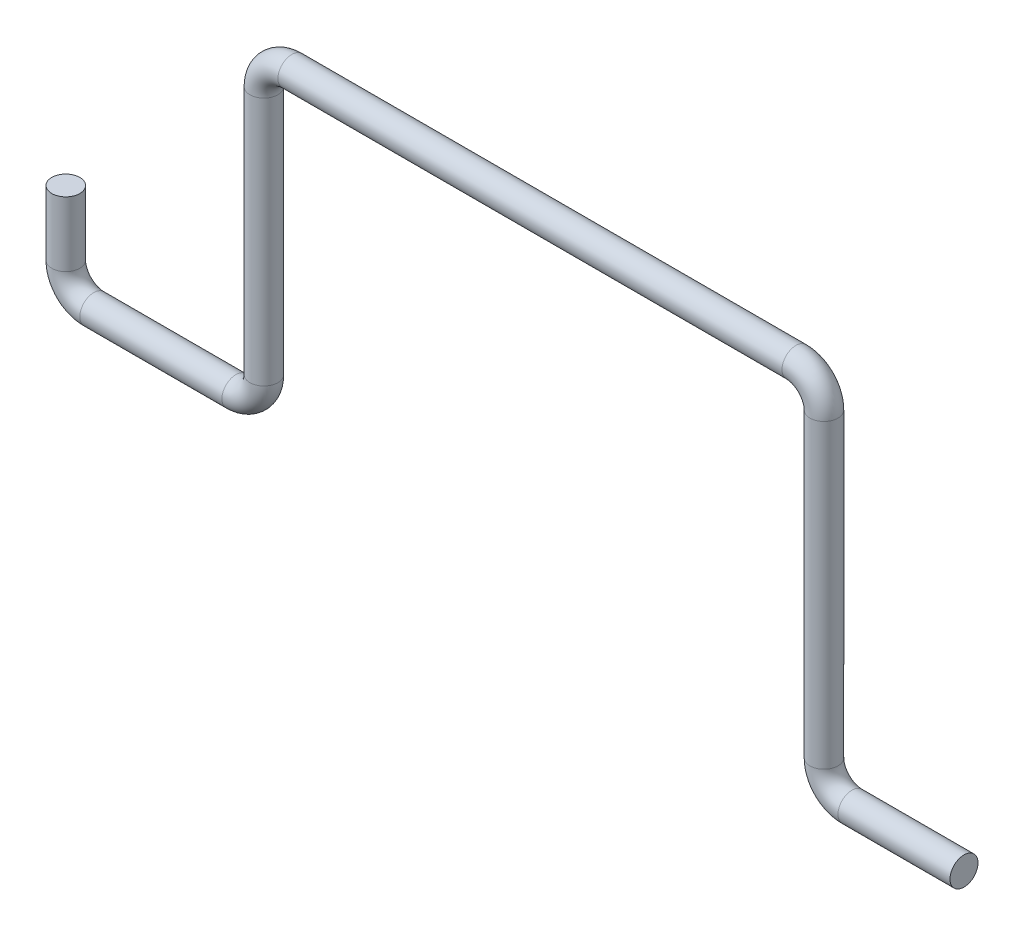
ISO-10303-21;
HEADER;
FILE_DESCRIPTION(('STEP AP214'),'2;1');
FILE_NAME('part.step','',(''),(''),'','','');
FILE_SCHEMA(('AUTOMOTIVE_DESIGN { 1 0 10303 214 1 1 1 1 }'));
ENDSEC;
DATA;
#1=APPLICATION_CONTEXT('core data for automotive mechanical design processes');
#2=APPLICATION_PROTOCOL_DEFINITION('international standard','automotive_design',2000,#1);
#3=PRODUCT_CONTEXT('',#1,'mechanical');
#4=PRODUCT('Part','Part','',(#3));
#5=PRODUCT_RELATED_PRODUCT_CATEGORY('part','',(#4));
#6=PRODUCT_DEFINITION_FORMATION('','',#4);
#7=PRODUCT_DEFINITION_CONTEXT('part definition',#1,'design');
#8=PRODUCT_DEFINITION('design','',#6,#7);
#9=PRODUCT_DEFINITION_SHAPE('','',#8);
#10=(LENGTH_UNIT() NAMED_UNIT(*) SI_UNIT(.MILLI.,.METRE.));
#11=(NAMED_UNIT(*) PLANE_ANGLE_UNIT() SI_UNIT($,.RADIAN.));
#12=(NAMED_UNIT(*) SI_UNIT($,.STERADIAN.) SOLID_ANGLE_UNIT());
#13=UNCERTAINTY_MEASURE_WITH_UNIT(LENGTH_MEASURE(1.E-05),#10,'distance_accuracy_value','');
#14=(GEOMETRIC_REPRESENTATION_CONTEXT(3) GLOBAL_UNCERTAINTY_ASSIGNED_CONTEXT((#13)) GLOBAL_UNIT_ASSIGNED_CONTEXT((#10,
#11,#12)) REPRESENTATION_CONTEXT('',''));
#15=CARTESIAN_POINT('',(0.,0.,0.));
#16=DIRECTION('',(0.,0.,1.));
#17=DIRECTION('',(1.,0.,0.));
#18=AXIS2_PLACEMENT_3D('',#15,#16,#17);
#19=CARTESIAN_POINT('',(0.,0.,0.));
#20=DIRECTION('',(1.,0.,0.));
#21=DIRECTION('',(0.,0.,-1.));
#22=AXIS2_PLACEMENT_3D('',#19,#20,#21);
#23=PLANE('',#22);
#24=CARTESIAN_POINT('',(0.,0.,0.));
#25=DIRECTION('',(1.,0.,0.));
#26=DIRECTION('',(0.,0.,-1.));
#27=AXIS2_PLACEMENT_3D('',#24,#25,#26);
#28=CIRCLE('',#27,0.1);
#29=CARTESIAN_POINT('',(0.,0.,-0.1));
#30=VERTEX_POINT('',#29);
#31=EDGE_CURVE('E71',#30,#30,#28,.T.);
#32=ORIENTED_EDGE('',*,*,#31,.T.);
#33=EDGE_LOOP('',(#32));
#34=FACE_BOUND('',#33,.T.);
#35=ADVANCED_FACE('F31',(#34),#23,.T.);
#36=CARTESIAN_POINT('',(-6.41500367322578,1.03268464664552,0.));
#37=DIRECTION('',(0.,-1.,0.));
#38=DIRECTION('',(0.,0.,-1.));
#39=AXIS2_PLACEMENT_3D('',#36,#37,#38);
#40=PLANE('',#39);
#41=CARTESIAN_POINT('',(-6.41500367322578,1.03268464664552,0.));
#42=DIRECTION('',(0.,-1.,0.));
#43=DIRECTION('',(0.,0.,-1.));
#44=AXIS2_PLACEMENT_3D('',#41,#42,#43);
#45=CIRCLE('',#44,0.1);
#46=CARTESIAN_POINT('',(-6.41500367322578,1.03268464664552,-0.1));
#47=VERTEX_POINT('',#46);
#48=EDGE_CURVE('E10',#47,#47,#45,.T.);
#49=ORIENTED_EDGE('',*,*,#48,.F.);
#50=EDGE_LOOP('',(#49));
#51=FACE_BOUND('',#50,.T.);
#52=ADVANCED_FACE('F79',(#51),#40,.F.);
#53=CARTESIAN_POINT('',(0.,0.,0.));
#54=DIRECTION('',(-1.,0.,0.));
#55=DIRECTION('',(0.,0.,1.));
#56=AXIS2_PLACEMENT_3D('',#53,#54,#55);
#57=CYLINDRICAL_SURFACE('',#56,0.1);
#58=CARTESIAN_POINT('',(-0.8,0.,0.));
#59=DIRECTION('',(1.,0.,0.));
#60=DIRECTION('',(0.,0.,-1.));
#61=AXIS2_PLACEMENT_3D('',#58,#59,#60);
#62=CIRCLE('',#61,0.1);
#63=CARTESIAN_POINT('',(-0.799999999999999,-0.1,0.));
#64=VERTEX_POINT('',#63);
#65=EDGE_CURVE('E68',#64,#64,#62,.T.);
#66=ORIENTED_EDGE('',*,*,#65,.T.);
#67=EDGE_LOOP('',(#66));
#68=FACE_BOUND('',#67,.T.);
#69=ORIENTED_EDGE('',*,*,#31,.F.);
#70=EDGE_LOOP('',(#69));
#71=FACE_BOUND('',#70,.T.);
#72=ADVANCED_FACE('F76',(#68,#71),#57,.T.);
#73=CARTESIAN_POINT('',(-0.8,0.2,0.));
#74=DIRECTION('',(0.,0.,-1.));
#75=DIRECTION('',(-1.,0.,0.));
#76=AXIS2_PLACEMENT_3D('',#73,#74,#75);
#77=TOROIDAL_SURFACE('',#76,0.2,0.1);
#78=CARTESIAN_POINT('',(-1.,0.2,0.));
#79=DIRECTION('',(0.,-1.,0.));
#80=DIRECTION('',(0.,0.,-1.));
#81=AXIS2_PLACEMENT_3D('',#78,#79,#80);
#82=CIRCLE('',#81,0.1);
#83=CARTESIAN_POINT('',(-1.1,0.2,0.));
#84=VERTEX_POINT('',#83);
#85=EDGE_CURVE('E65',#84,#84,#82,.T.);
#86=CARTESIAN_POINT('',(-0.8,0.2,0.));
#87=DIRECTION('',(0.,0.,-1.));
#88=DIRECTION('',(-1.,0.,0.));
#89=AXIS2_PLACEMENT_3D('',#86,#87,#88);
#90=CIRCLE('',#89,0.3);
#91=EDGE_CURVE('',#64,#84,#90,.T.);
#92=ORIENTED_EDGE('',*,*,#65,.F.);
#93=ORIENTED_EDGE('',*,*,#85,.T.);
#94=ORIENTED_EDGE('',*,*,#91,.T.);
#95=ORIENTED_EDGE('',*,*,#91,.F.);
#96=EDGE_LOOP('',(#92,#94,#93,#95));
#97=FACE_BOUND('',#96,.T.);
#98=ADVANCED_FACE('F78',(#97),#77,.T.);
#99=CARTESIAN_POINT('',(-1.,0.2,0.));
#100=DIRECTION('',(0.,1.,0.));
#101=DIRECTION('',(0.,0.,1.));
#102=AXIS2_PLACEMENT_3D('',#99,#100,#101);
#103=CYLINDRICAL_SURFACE('',#102,0.1);
#104=CARTESIAN_POINT('',(-1.,2.35103817966074,0.));
#105=DIRECTION('',(0.,-1.,0.));
#106=DIRECTION('',(0.,0.,-1.));
#107=AXIS2_PLACEMENT_3D('',#104,#105,#106);
#108=CIRCLE('',#107,0.1);
#109=CARTESIAN_POINT('',(-0.9,2.35103817966074,0.));
#110=VERTEX_POINT('',#109);
#111=EDGE_CURVE('E62',#110,#110,#108,.T.);
#112=ORIENTED_EDGE('',*,*,#111,.T.);
#113=EDGE_LOOP('',(#112));
#114=FACE_BOUND('',#113,.T.);
#115=ORIENTED_EDGE('',*,*,#85,.F.);
#116=EDGE_LOOP('',(#115));
#117=FACE_BOUND('',#116,.T.);
#118=ADVANCED_FACE('F86',(#114,#117),#103,.T.);
#119=CARTESIAN_POINT('',(-1.2,2.35103817966074,0.));
#120=DIRECTION('',(0.,0.,1.));
#121=DIRECTION('',(1.,0.,0.));
#122=AXIS2_PLACEMENT_3D('',#119,#120,#121);
#123=TOROIDAL_SURFACE('',#122,0.2,0.1);
#124=CARTESIAN_POINT('',(-1.2,2.55103817966074,0.));
#125=DIRECTION('',(1.,0.,0.));
#126=DIRECTION('',(0.,0.,-1.));
#127=AXIS2_PLACEMENT_3D('',#124,#125,#126);
#128=CIRCLE('',#127,0.1);
#129=CARTESIAN_POINT('',(-1.2,2.65103817966074,0.));
#130=VERTEX_POINT('',#129);
#131=EDGE_CURVE('E59',#130,#130,#128,.T.);
#132=CARTESIAN_POINT('',(-1.2,2.35103817966074,0.));
#133=DIRECTION('',(0.,0.,1.));
#134=DIRECTION('',(1.,0.,0.));
#135=AXIS2_PLACEMENT_3D('',#132,#133,#134);
#136=CIRCLE('',#135,0.3);
#137=EDGE_CURVE('',#110,#130,#136,.T.);
#138=ORIENTED_EDGE('',*,*,#111,.F.);
#139=ORIENTED_EDGE('',*,*,#131,.T.);
#140=ORIENTED_EDGE('',*,*,#137,.T.);
#141=ORIENTED_EDGE('',*,*,#137,.F.);
#142=EDGE_LOOP('',(#138,#140,#139,#141));
#143=FACE_BOUND('',#142,.T.);
#144=ADVANCED_FACE('F119',(#143),#123,.T.);
#145=CARTESIAN_POINT('',(-1.2,2.55103817966074,0.));
#146=DIRECTION('',(-1.,0.,0.));
#147=DIRECTION('',(0.,0.,1.));
#148=AXIS2_PLACEMENT_3D('',#145,#146,#147);
#149=CYLINDRICAL_SURFACE('',#148,0.1);
#150=CARTESIAN_POINT('',(-4.8,2.55103817966074,0.));
#151=DIRECTION('',(1.,0.,0.));
#152=DIRECTION('',(0.,0.,-1.));
#153=AXIS2_PLACEMENT_3D('',#150,#151,#152);
#154=CIRCLE('',#153,0.1);
#155=CARTESIAN_POINT('',(-4.8,2.65103817966074,0.));
#156=VERTEX_POINT('',#155);
#157=EDGE_CURVE('E56',#156,#156,#154,.T.);
#158=ORIENTED_EDGE('',*,*,#157,.T.);
#159=EDGE_LOOP('',(#158));
#160=FACE_BOUND('',#159,.T.);
#161=ORIENTED_EDGE('',*,*,#131,.F.);
#162=EDGE_LOOP('',(#161));
#163=FACE_BOUND('',#162,.T.);
#164=ADVANCED_FACE('F115',(#160,#163),#149,.T.);
#165=CARTESIAN_POINT('',(-4.8,2.35103817966074,0.));
#166=DIRECTION('',(0.,0.,1.));
#167=DIRECTION('',(1.,0.,0.));
#168=AXIS2_PLACEMENT_3D('',#165,#166,#167);
#169=TOROIDAL_SURFACE('',#168,0.2,0.1);
#170=CARTESIAN_POINT('',(-5.,2.35103817966074,0.));
#171=DIRECTION('',(0.,1.,0.));
#172=DIRECTION('',(0.,0.,-1.));
#173=AXIS2_PLACEMENT_3D('',#170,#171,#172);
#174=CIRCLE('',#173,0.1);
#175=CARTESIAN_POINT('',(-5.1,2.35103817966074,0.));
#176=VERTEX_POINT('',#175);
#177=EDGE_CURVE('E53',#176,#176,#174,.T.);
#178=CARTESIAN_POINT('',(-4.8,2.35103817966074,0.));
#179=DIRECTION('',(0.,0.,1.));
#180=DIRECTION('',(1.,0.,0.));
#181=AXIS2_PLACEMENT_3D('',#178,#179,#180);
#182=CIRCLE('',#181,0.3);
#183=EDGE_CURVE('',#156,#176,#182,.T.);
#184=ORIENTED_EDGE('',*,*,#157,.F.);
#185=ORIENTED_EDGE('',*,*,#177,.T.);
#186=ORIENTED_EDGE('',*,*,#183,.T.);
#187=ORIENTED_EDGE('',*,*,#183,.F.);
#188=EDGE_LOOP('',(#184,#186,#185,#187));
#189=FACE_BOUND('',#188,.T.);
#190=ADVANCED_FACE('F111',(#189),#169,.T.);
#191=CARTESIAN_POINT('',(-5.,2.35103817966074,0.));
#192=DIRECTION('',(0.,-1.,0.));
#193=DIRECTION('',(0.,0.,-1.));
#194=AXIS2_PLACEMENT_3D('',#191,#192,#193);
#195=CYLINDRICAL_SURFACE('',#194,0.1);
#196=CARTESIAN_POINT('',(-5.,0.570308290541743,0.));
#197=DIRECTION('',(0.,1.,0.));
#198=DIRECTION('',(0.,0.,-1.));
#199=AXIS2_PLACEMENT_3D('',#196,#197,#198);
#200=CIRCLE('',#199,0.1);
#201=CARTESIAN_POINT('',(-4.9,0.570308290541743,0.));
#202=VERTEX_POINT('',#201);
#203=EDGE_CURVE('E50',#202,#202,#200,.T.);
#204=ORIENTED_EDGE('',*,*,#203,.T.);
#205=EDGE_LOOP('',(#204));
#206=FACE_BOUND('',#205,.T.);
#207=ORIENTED_EDGE('',*,*,#177,.F.);
#208=EDGE_LOOP('',(#207));
#209=FACE_BOUND('',#208,.T.);
#210=ADVANCED_FACE('F107',(#206,#209),#195,.T.);
#211=CARTESIAN_POINT('',(-5.2,0.570308290541743,0.));
#212=DIRECTION('',(0.,0.,-1.));
#213=DIRECTION('',(-1.,0.,0.));
#214=AXIS2_PLACEMENT_3D('',#211,#212,#213);
#215=TOROIDAL_SURFACE('',#214,0.2,0.1);
#216=CARTESIAN_POINT('',(-5.2,0.370308290541743,0.));
#217=DIRECTION('',(1.,0.,0.));
#218=DIRECTION('',(0.,0.,-1.));
#219=AXIS2_PLACEMENT_3D('',#216,#217,#218);
#220=CIRCLE('',#219,0.1);
#221=CARTESIAN_POINT('',(-5.2,0.270308290541744,0.));
#222=VERTEX_POINT('',#221);
#223=EDGE_CURVE('E45',#222,#222,#220,.T.);
#224=CARTESIAN_POINT('',(-5.2,0.570308290541743,0.));
#225=DIRECTION('',(0.,0.,-1.));
#226=DIRECTION('',(-1.,0.,0.));
#227=AXIS2_PLACEMENT_3D('',#224,#225,#226);
#228=CIRCLE('',#227,0.3);
#229=EDGE_CURVE('',#202,#222,#228,.T.);
#230=ORIENTED_EDGE('',*,*,#203,.F.);
#231=ORIENTED_EDGE('',*,*,#223,.T.);
#232=ORIENTED_EDGE('',*,*,#229,.T.);
#233=ORIENTED_EDGE('',*,*,#229,.F.);
#234=EDGE_LOOP('',(#230,#232,#231,#233));
#235=FACE_BOUND('',#234,.T.);
#236=ADVANCED_FACE('F103',(#235),#215,.T.);
#237=CARTESIAN_POINT('',(-5.2,0.370308290541743,0.));
#238=DIRECTION('',(-1.,0.,0.));
#239=DIRECTION('',(0.,-1.,0.));
#240=AXIS2_PLACEMENT_3D('',#237,#238,#239);
#241=CYLINDRICAL_SURFACE('',#240,0.1);
#242=CARTESIAN_POINT('',(-6.21500367322578,0.370308290541743,0.));
#243=DIRECTION('',(1.,0.,0.));
#244=DIRECTION('',(0.,0.,-1.));
#245=AXIS2_PLACEMENT_3D('',#242,#243,#244);
#246=CIRCLE('',#245,0.1);
#247=CARTESIAN_POINT('',(-6.21500367322578,0.270308290541743,0.));
#248=VERTEX_POINT('',#247);
#249=EDGE_CURVE('E41',#248,#248,#246,.T.);
#250=ORIENTED_EDGE('',*,*,#249,.T.);
#251=EDGE_LOOP('',(#250));
#252=FACE_BOUND('',#251,.T.);
#253=ORIENTED_EDGE('',*,*,#223,.F.);
#254=EDGE_LOOP('',(#253));
#255=FACE_BOUND('',#254,.T.);
#256=ADVANCED_FACE('F97',(#252,#255),#241,.T.);
#257=CARTESIAN_POINT('',(-6.21500367322578,0.570308290541743,0.));
#258=DIRECTION('',(0.,0.,-1.));
#259=DIRECTION('',(-1.,0.,0.));
#260=AXIS2_PLACEMENT_3D('',#257,#258,#259);
#261=TOROIDAL_SURFACE('',#260,0.2,0.1);
#262=CARTESIAN_POINT('',(-6.41500367322578,0.570308290541743,0.));
#263=DIRECTION('',(0.,-1.,0.));
#264=DIRECTION('',(0.,0.,-1.));
#265=AXIS2_PLACEMENT_3D('',#262,#263,#264);
#266=CIRCLE('',#265,0.1);
#267=CARTESIAN_POINT('',(-6.51500367322578,0.570308290541743,0.));
#268=VERTEX_POINT('',#267);
#269=EDGE_CURVE('E37',#268,#268,#266,.T.);
#270=CARTESIAN_POINT('',(-6.21500367322578,0.570308290541743,0.));
#271=DIRECTION('',(0.,0.,-1.));
#272=DIRECTION('',(-1.,0.,0.));
#273=AXIS2_PLACEMENT_3D('',#270,#271,#272);
#274=CIRCLE('',#273,0.3);
#275=EDGE_CURVE('',#248,#268,#274,.T.);
#276=ORIENTED_EDGE('',*,*,#249,.F.);
#277=ORIENTED_EDGE('',*,*,#269,.T.);
#278=ORIENTED_EDGE('',*,*,#275,.T.);
#279=ORIENTED_EDGE('',*,*,#275,.F.);
#280=EDGE_LOOP('',(#276,#278,#277,#279));
#281=FACE_BOUND('',#280,.T.);
#282=ADVANCED_FACE('F92',(#281),#261,.T.);
#283=CARTESIAN_POINT('',(-6.41500367322578,0.570308290541743,0.));
#284=DIRECTION('',(0.,1.,0.));
#285=DIRECTION('',(0.,0.,1.));
#286=AXIS2_PLACEMENT_3D('',#283,#284,#285);
#287=CYLINDRICAL_SURFACE('',#286,0.1);
#288=ORIENTED_EDGE('',*,*,#48,.T.);
#289=EDGE_LOOP('',(#288));
#290=FACE_BOUND('',#289,.T.);
#291=ORIENTED_EDGE('',*,*,#269,.F.);
#292=EDGE_LOOP('',(#291));
#293=FACE_BOUND('',#292,.T.);
#294=ADVANCED_FACE('F90',(#290,#293),#287,.T.);
#295=CLOSED_SHELL('',(#35,#52,#72,#98,#118,#144,#164,#190,#210,#236,#256,#282,#294));
#296=MANIFOLD_SOLID_BREP('B2',#295);
#297=ADVANCED_BREP_SHAPE_REPRESENTATION('',(#18,#296),#14);
#298=SHAPE_DEFINITION_REPRESENTATION(#9,#297);
ENDSEC;
END-ISO-10303-21;
